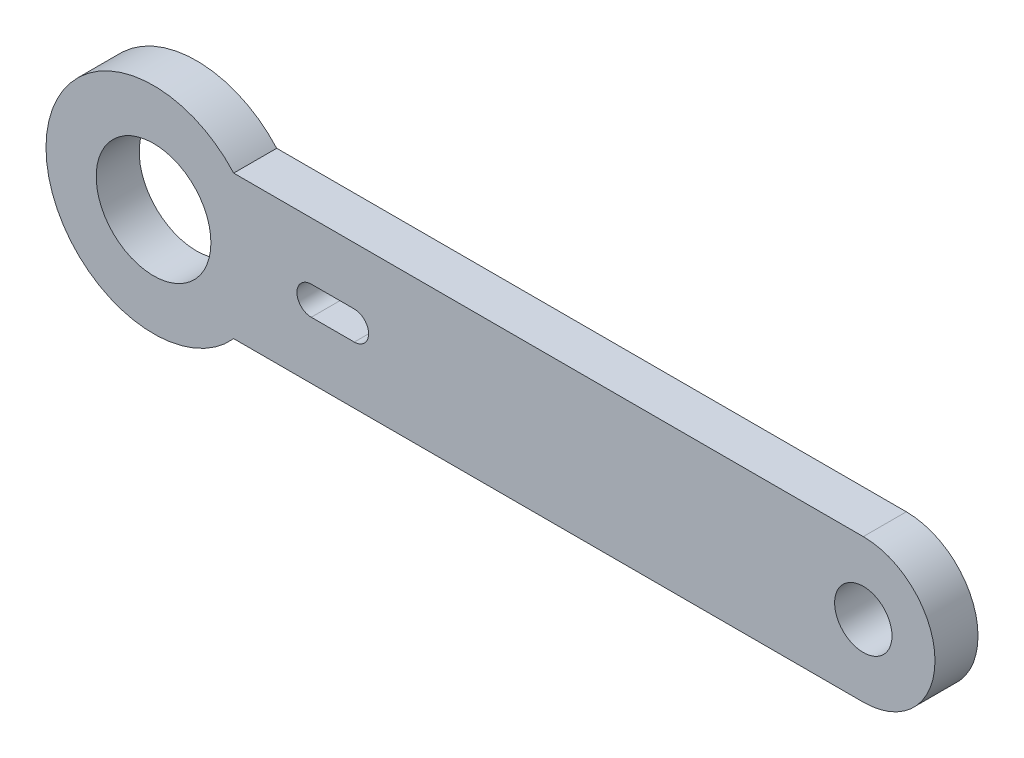
ISO-10303-21;
HEADER;
FILE_DESCRIPTION(('STEP AP214'),'2;1');
FILE_NAME('part.step','',(''),(''),'','','');
FILE_SCHEMA(('AUTOMOTIVE_DESIGN { 1 0 10303 214 1 1 1 1 }'));
ENDSEC;
DATA;
#1=APPLICATION_CONTEXT('core data for automotive mechanical design processes');
#2=APPLICATION_PROTOCOL_DEFINITION('international standard','automotive_design',2000,#1);
#3=PRODUCT_CONTEXT('',#1,'mechanical');
#4=PRODUCT('Part','Part','',(#3));
#5=PRODUCT_RELATED_PRODUCT_CATEGORY('part','',(#4));
#6=PRODUCT_DEFINITION_FORMATION('','',#4);
#7=PRODUCT_DEFINITION_CONTEXT('part definition',#1,'design');
#8=PRODUCT_DEFINITION('design','',#6,#7);
#9=PRODUCT_DEFINITION_SHAPE('','',#8);
#10=(LENGTH_UNIT() NAMED_UNIT(*) SI_UNIT(.MILLI.,.METRE.));
#11=(NAMED_UNIT(*) PLANE_ANGLE_UNIT() SI_UNIT($,.RADIAN.));
#12=(NAMED_UNIT(*) SI_UNIT($,.STERADIAN.) SOLID_ANGLE_UNIT());
#13=UNCERTAINTY_MEASURE_WITH_UNIT(LENGTH_MEASURE(1.E-05),#10,'distance_accuracy_value','');
#14=(GEOMETRIC_REPRESENTATION_CONTEXT(3) GLOBAL_UNCERTAINTY_ASSIGNED_CONTEXT((#13)) GLOBAL_UNIT_ASSIGNED_CONTEXT((#10,
#11,#12)) REPRESENTATION_CONTEXT('',''));
#15=CARTESIAN_POINT('',(0.,0.,0.));
#16=DIRECTION('',(0.,0.,1.));
#17=DIRECTION('',(1.,0.,0.));
#18=AXIS2_PLACEMENT_3D('',#15,#16,#17);
#19=CARTESIAN_POINT('',(49.5,0.,1.5));
#20=DIRECTION('',(0.,0.,1.));
#21=DIRECTION('',(1.,0.,0.));
#22=AXIS2_PLACEMENT_3D('',#19,#20,#21);
#23=PLANE('',#22);
#24=CARTESIAN_POINT('',(0.,0.,1.5));
#25=DIRECTION('',(0.,0.,1.));
#26=DIRECTION('',(1.,0.,0.));
#27=AXIS2_PLACEMENT_3D('',#24,#25,#26);
#28=CIRCLE('',#27,4.);
#29=CARTESIAN_POINT('',(4.,0.,1.5));
#30=VERTEX_POINT('',#29);
#31=EDGE_CURVE('E137',#30,#30,#28,.T.);
#32=ORIENTED_EDGE('',*,*,#31,.F.);
#33=EDGE_LOOP('',(#32));
#34=FACE_BOUND('',#33,.T.);
#35=CARTESIAN_POINT('',(49.5,0.,1.5));
#36=DIRECTION('',(0.,0.,1.));
#37=DIRECTION('',(1.,0.,0.));
#38=AXIS2_PLACEMENT_3D('',#35,#36,#37);
#39=CIRCLE('',#38,5.);
#40=CARTESIAN_POINT('',(49.5,-5.,1.5));
#41=VERTEX_POINT('',#40);
#42=CARTESIAN_POINT('',(49.5,5.,1.5));
#43=VERTEX_POINT('',#42);
#44=EDGE_CURVE('E143',#41,#43,#39,.T.);
#45=ORIENTED_EDGE('',*,*,#44,.T.);
#46=DIRECTION('',(-1.,0.,0.));
#47=VECTOR('',#46,1.);
#48=CARTESIAN_POINT('',(5.59016994374947,5.,1.5));
#49=LINE('',#48,#47);
#50=CARTESIAN_POINT('',(5.59016994374947,5.,1.5));
#51=VERTEX_POINT('',#50);
#52=EDGE_CURVE('E146',#43,#51,#49,.T.);
#53=ORIENTED_EDGE('',*,*,#52,.T.);
#54=CARTESIAN_POINT('',(0.,0.,1.5));
#55=DIRECTION('',(0.,0.,1.));
#56=DIRECTION('',(1.,0.,0.));
#57=AXIS2_PLACEMENT_3D('',#54,#55,#56);
#58=CIRCLE('',#57,7.5);
#59=CARTESIAN_POINT('',(5.59016994374947,-5.,1.5));
#60=VERTEX_POINT('',#59);
#61=EDGE_CURVE('E149',#51,#60,#58,.T.);
#62=ORIENTED_EDGE('',*,*,#61,.T.);
#63=DIRECTION('',(1.,0.,0.));
#64=VECTOR('',#63,1.);
#65=CARTESIAN_POINT('',(5.59016994374947,-5.,1.5));
#66=LINE('',#65,#64);
#67=EDGE_CURVE('E151',#60,#41,#66,.T.);
#68=ORIENTED_EDGE('',*,*,#67,.T.);
#69=EDGE_LOOP('',(#45,#53,#62,#68));
#70=FACE_BOUND('',#69,.T.);
#71=CARTESIAN_POINT('',(49.5,0.,1.5));
#72=DIRECTION('',(0.,0.,1.));
#73=DIRECTION('',(1.,0.,0.));
#74=AXIS2_PLACEMENT_3D('',#71,#72,#73);
#75=CIRCLE('',#74,2.);
#76=CARTESIAN_POINT('',(51.5,0.,1.5));
#77=VERTEX_POINT('',#76);
#78=EDGE_CURVE('E131',#77,#77,#75,.T.);
#79=ORIENTED_EDGE('',*,*,#78,.F.);
#80=EDGE_LOOP('',(#79));
#81=FACE_BOUND('',#80,.T.);
#82=DIRECTION('',(1.,0.,0.));
#83=VECTOR('',#82,1.);
#84=CARTESIAN_POINT('',(11.,-1.,1.5));
#85=LINE('',#84,#83);
#86=CARTESIAN_POINT('',(11.,-1.,1.5));
#87=VERTEX_POINT('',#86);
#88=CARTESIAN_POINT('',(14.,-0.999999999999999,1.5));
#89=VERTEX_POINT('',#88);
#90=EDGE_CURVE('E103',#87,#89,#85,.T.);
#91=ORIENTED_EDGE('',*,*,#90,.F.);
#92=CARTESIAN_POINT('',(11.,0.,1.5));
#93=DIRECTION('',(0.,0.,1.));
#94=DIRECTION('',(1.,0.,0.));
#95=AXIS2_PLACEMENT_3D('',#92,#93,#94);
#96=CIRCLE('',#95,1.);
#97=CARTESIAN_POINT('',(11.,1.,1.5));
#98=VERTEX_POINT('',#97);
#99=EDGE_CURVE('E95',#98,#87,#96,.T.);
#100=ORIENTED_EDGE('',*,*,#99,.F.);
#101=DIRECTION('',(-1.,0.,0.));
#102=VECTOR('',#101,1.);
#103=CARTESIAN_POINT('',(11.,1.,1.5));
#104=LINE('',#103,#102);
#105=CARTESIAN_POINT('',(14.,0.999999999999999,1.5));
#106=VERTEX_POINT('',#105);
#107=EDGE_CURVE('E117',#106,#98,#104,.T.);
#108=ORIENTED_EDGE('',*,*,#107,.F.);
#109=CARTESIAN_POINT('',(14.,0.,1.5));
#110=DIRECTION('',(0.,0.,1.));
#111=DIRECTION('',(1.,0.,0.));
#112=AXIS2_PLACEMENT_3D('',#109,#110,#111);
#113=CIRCLE('',#112,0.999999999999999);
#114=EDGE_CURVE('E115',#89,#106,#113,.T.);
#115=ORIENTED_EDGE('',*,*,#114,.F.);
#116=EDGE_LOOP('',(#91,#100,#108,#115));
#117=FACE_BOUND('',#116,.T.);
#118=ADVANCED_FACE('F30',(#34,#70,#81,#117),#23,.T.);
#119=CARTESIAN_POINT('',(49.5,0.,-1.5));
#120=DIRECTION('',(0.,0.,1.));
#121=DIRECTION('',(1.,0.,0.));
#122=AXIS2_PLACEMENT_3D('',#119,#120,#121);
#123=PLANE('',#122);
#124=CARTESIAN_POINT('',(49.5,0.,-1.5));
#125=DIRECTION('',(0.,0.,1.));
#126=DIRECTION('',(1.,0.,0.));
#127=AXIS2_PLACEMENT_3D('',#124,#125,#126);
#128=CIRCLE('',#127,2.);
#129=CARTESIAN_POINT('',(51.5,0.,-1.5));
#130=VERTEX_POINT('',#129);
#131=EDGE_CURVE('E111',#130,#130,#128,.T.);
#132=ORIENTED_EDGE('',*,*,#131,.T.);
#133=EDGE_LOOP('',(#132));
#134=FACE_BOUND('',#133,.T.);
#135=CARTESIAN_POINT('',(0.,0.,-1.5));
#136=DIRECTION('',(0.,0.,1.));
#137=DIRECTION('',(1.,0.,0.));
#138=AXIS2_PLACEMENT_3D('',#135,#136,#137);
#139=CIRCLE('',#138,4.);
#140=CARTESIAN_POINT('',(4.,0.,-1.5));
#141=VERTEX_POINT('',#140);
#142=EDGE_CURVE('E134',#141,#141,#139,.T.);
#143=ORIENTED_EDGE('',*,*,#142,.T.);
#144=EDGE_LOOP('',(#143));
#145=FACE_BOUND('',#144,.T.);
#146=CARTESIAN_POINT('',(49.5,0.,-1.5));
#147=DIRECTION('',(0.,0.,1.));
#148=DIRECTION('',(1.,0.,0.));
#149=AXIS2_PLACEMENT_3D('',#146,#147,#148);
#150=CIRCLE('',#149,5.);
#151=CARTESIAN_POINT('',(49.5,-5.,-1.5));
#152=VERTEX_POINT('',#151);
#153=CARTESIAN_POINT('',(49.5,5.,-1.5));
#154=VERTEX_POINT('',#153);
#155=EDGE_CURVE('E140',#152,#154,#150,.T.);
#156=ORIENTED_EDGE('',*,*,#155,.F.);
#157=DIRECTION('',(1.,0.,0.));
#158=VECTOR('',#157,1.);
#159=CARTESIAN_POINT('',(5.59016994374947,-5.,-1.5));
#160=LINE('',#159,#158);
#161=CARTESIAN_POINT('',(5.59016994374947,-5.,-1.5));
#162=VERTEX_POINT('',#161);
#163=EDGE_CURVE('E147',#162,#152,#160,.T.);
#164=ORIENTED_EDGE('',*,*,#163,.F.);
#165=CARTESIAN_POINT('',(0.,0.,-1.5));
#166=DIRECTION('',(0.,0.,1.));
#167=DIRECTION('',(1.,0.,0.));
#168=AXIS2_PLACEMENT_3D('',#165,#166,#167);
#169=CIRCLE('',#168,7.5);
#170=CARTESIAN_POINT('',(5.59016994374947,5.,-1.5));
#171=VERTEX_POINT('',#170);
#172=EDGE_CURVE('E158',#171,#162,#169,.T.);
#173=ORIENTED_EDGE('',*,*,#172,.F.);
#174=DIRECTION('',(-1.,0.,0.));
#175=VECTOR('',#174,1.);
#176=CARTESIAN_POINT('',(5.59016994374947,5.,-1.5));
#177=LINE('',#176,#175);
#178=EDGE_CURVE('E156',#154,#171,#177,.T.);
#179=ORIENTED_EDGE('',*,*,#178,.F.);
#180=EDGE_LOOP('',(#156,#164,#173,#179));
#181=FACE_BOUND('',#180,.T.);
#182=CARTESIAN_POINT('',(11.,0.,-1.5));
#183=DIRECTION('',(0.,0.,1.));
#184=DIRECTION('',(1.,0.,0.));
#185=AXIS2_PLACEMENT_3D('',#182,#183,#184);
#186=CIRCLE('',#185,1.);
#187=CARTESIAN_POINT('',(11.,1.,-1.5));
#188=VERTEX_POINT('',#187);
#189=CARTESIAN_POINT('',(11.,-1.,-1.5));
#190=VERTEX_POINT('',#189);
#191=EDGE_CURVE('E53',#188,#190,#186,.T.);
#192=ORIENTED_EDGE('',*,*,#191,.T.);
#193=DIRECTION('',(1.,0.,0.));
#194=VECTOR('',#193,1.);
#195=CARTESIAN_POINT('',(11.,-1.,-1.5));
#196=LINE('',#195,#194);
#197=CARTESIAN_POINT('',(14.,-0.999999999999999,-1.5));
#198=VERTEX_POINT('',#197);
#199=EDGE_CURVE('E110',#190,#198,#196,.T.);
#200=ORIENTED_EDGE('',*,*,#199,.T.);
#201=CARTESIAN_POINT('',(14.,0.,-1.5));
#202=DIRECTION('',(0.,0.,1.));
#203=DIRECTION('',(1.,0.,0.));
#204=AXIS2_PLACEMENT_3D('',#201,#202,#203);
#205=CIRCLE('',#204,0.999999999999999);
#206=CARTESIAN_POINT('',(14.,0.999999999999999,-1.5));
#207=VERTEX_POINT('',#206);
#208=EDGE_CURVE('E123',#198,#207,#205,.T.);
#209=ORIENTED_EDGE('',*,*,#208,.T.);
#210=DIRECTION('',(-1.,0.,0.));
#211=VECTOR('',#210,1.);
#212=CARTESIAN_POINT('',(11.,1.,-1.5));
#213=LINE('',#212,#211);
#214=EDGE_CURVE('E104',#207,#188,#213,.T.);
#215=ORIENTED_EDGE('',*,*,#214,.T.);
#216=EDGE_LOOP('',(#192,#200,#209,#215));
#217=FACE_BOUND('',#216,.T.);
#218=ADVANCED_FACE('F176',(#134,#145,#181,#217),#123,.F.);
#219=CARTESIAN_POINT('',(49.5,0.,1.5));
#220=DIRECTION('',(0.,0.,-1.));
#221=DIRECTION('',(-1.,0.,0.));
#222=AXIS2_PLACEMENT_3D('',#219,#220,#221);
#223=CYLINDRICAL_SURFACE('',#222,5.);
#224=ORIENTED_EDGE('',*,*,#155,.T.);
#225=DIRECTION('',(0.,0.,-1.));
#226=VECTOR('',#225,1.);
#227=CARTESIAN_POINT('',(49.5,5.,1.5));
#228=LINE('',#227,#226);
#229=EDGE_CURVE('E11',#43,#154,#228,.T.);
#230=ORIENTED_EDGE('',*,*,#229,.F.);
#231=ORIENTED_EDGE('',*,*,#44,.F.);
#232=DIRECTION('',(0.,0.,-1.));
#233=VECTOR('',#232,1.);
#234=CARTESIAN_POINT('',(49.5,-5.,1.5));
#235=LINE('',#234,#233);
#236=EDGE_CURVE('E153',#41,#152,#235,.T.);
#237=ORIENTED_EDGE('',*,*,#236,.T.);
#238=EDGE_LOOP('',(#224,#230,#231,#237));
#239=FACE_BOUND('',#238,.T.);
#240=ADVANCED_FACE('F32',(#239),#223,.T.);
#241=CARTESIAN_POINT('',(5.59016994374947,5.,1.5));
#242=DIRECTION('',(0.,-1.,0.));
#243=DIRECTION('',(0.,0.,-1.));
#244=AXIS2_PLACEMENT_3D('',#241,#242,#243);
#245=PLANE('',#244);
#246=ORIENTED_EDGE('',*,*,#178,.T.);
#247=DIRECTION('',(0.,0.,-1.));
#248=VECTOR('',#247,1.);
#249=CARTESIAN_POINT('',(5.59016994374947,5.,1.5));
#250=LINE('',#249,#248);
#251=EDGE_CURVE('E38',#51,#171,#250,.T.);
#252=ORIENTED_EDGE('',*,*,#251,.F.);
#253=ORIENTED_EDGE('',*,*,#52,.F.);
#254=ORIENTED_EDGE('',*,*,#229,.T.);
#255=EDGE_LOOP('',(#246,#252,#253,#254));
#256=FACE_BOUND('',#255,.T.);
#257=ADVANCED_FACE('F187',(#256),#245,.F.);
#258=CARTESIAN_POINT('',(0.,0.,1.5));
#259=DIRECTION('',(0.,0.,-1.));
#260=DIRECTION('',(-1.,0.,0.));
#261=AXIS2_PLACEMENT_3D('',#258,#259,#260);
#262=CYLINDRICAL_SURFACE('',#261,7.5);
#263=ORIENTED_EDGE('',*,*,#172,.T.);
#264=DIRECTION('',(0.,0.,-1.));
#265=VECTOR('',#264,1.);
#266=CARTESIAN_POINT('',(5.59016994374947,-5.,1.5));
#267=LINE('',#266,#265);
#268=EDGE_CURVE('E163',#60,#162,#267,.T.);
#269=ORIENTED_EDGE('',*,*,#268,.F.);
#270=ORIENTED_EDGE('',*,*,#61,.F.);
#271=ORIENTED_EDGE('',*,*,#251,.T.);
#272=EDGE_LOOP('',(#263,#269,#270,#271));
#273=FACE_BOUND('',#272,.T.);
#274=ADVANCED_FACE('F170',(#273),#262,.T.);
#275=CARTESIAN_POINT('',(5.59016994374947,-5.,1.5));
#276=DIRECTION('',(0.,1.,0.));
#277=DIRECTION('',(0.,0.,1.));
#278=AXIS2_PLACEMENT_3D('',#275,#276,#277);
#279=PLANE('',#278);
#280=ORIENTED_EDGE('',*,*,#163,.T.);
#281=ORIENTED_EDGE('',*,*,#236,.F.);
#282=ORIENTED_EDGE('',*,*,#67,.F.);
#283=ORIENTED_EDGE('',*,*,#268,.T.);
#284=EDGE_LOOP('',(#280,#281,#282,#283));
#285=FACE_BOUND('',#284,.T.);
#286=ADVANCED_FACE('F180',(#285),#279,.F.);
#287=CARTESIAN_POINT('',(0.,0.,1.5));
#288=DIRECTION('',(0.,0.,-1.));
#289=DIRECTION('',(-1.,0.,0.));
#290=AXIS2_PLACEMENT_3D('',#287,#288,#289);
#291=CYLINDRICAL_SURFACE('',#290,4.);
#292=ORIENTED_EDGE('',*,*,#31,.T.);
#293=EDGE_LOOP('',(#292));
#294=FACE_BOUND('',#293,.T.);
#295=ORIENTED_EDGE('',*,*,#142,.F.);
#296=EDGE_LOOP('',(#295));
#297=FACE_BOUND('',#296,.T.);
#298=ADVANCED_FACE('F204',(#294,#297),#291,.F.);
#299=CARTESIAN_POINT('',(49.5,0.,1.5));
#300=DIRECTION('',(0.,0.,-1.));
#301=DIRECTION('',(-1.,0.,0.));
#302=AXIS2_PLACEMENT_3D('',#299,#300,#301);
#303=CYLINDRICAL_SURFACE('',#302,2.);
#304=ORIENTED_EDGE('',*,*,#78,.T.);
#305=EDGE_LOOP('',(#304));
#306=FACE_BOUND('',#305,.T.);
#307=ORIENTED_EDGE('',*,*,#131,.F.);
#308=EDGE_LOOP('',(#307));
#309=FACE_BOUND('',#308,.T.);
#310=ADVANCED_FACE('F211',(#306,#309),#303,.F.);
#311=CARTESIAN_POINT('',(11.,0.,1.5));
#312=DIRECTION('',(0.,0.,-1.));
#313=DIRECTION('',(-1.,0.,0.));
#314=AXIS2_PLACEMENT_3D('',#311,#312,#313);
#315=CYLINDRICAL_SURFACE('',#314,1.);
#316=ORIENTED_EDGE('',*,*,#191,.F.);
#317=DIRECTION('',(0.,0.,-1.));
#318=VECTOR('',#317,1.);
#319=CARTESIAN_POINT('',(11.,1.,1.5));
#320=LINE('',#319,#318);
#321=EDGE_CURVE('E99',#98,#188,#320,.T.);
#322=ORIENTED_EDGE('',*,*,#321,.F.);
#323=ORIENTED_EDGE('',*,*,#99,.T.);
#324=DIRECTION('',(0.,0.,-1.));
#325=VECTOR('',#324,1.);
#326=CARTESIAN_POINT('',(11.,-1.,1.5));
#327=LINE('',#326,#325);
#328=EDGE_CURVE('E98',#87,#190,#327,.T.);
#329=ORIENTED_EDGE('',*,*,#328,.T.);
#330=EDGE_LOOP('',(#316,#322,#323,#329));
#331=FACE_BOUND('',#330,.T.);
#332=ADVANCED_FACE('F97',(#331),#315,.F.);
#333=CARTESIAN_POINT('',(11.,-1.,1.5));
#334=DIRECTION('',(0.,1.,0.));
#335=DIRECTION('',(-1.,0.,0.));
#336=AXIS2_PLACEMENT_3D('',#333,#334,#335);
#337=PLANE('',#336);
#338=ORIENTED_EDGE('',*,*,#199,.F.);
#339=ORIENTED_EDGE('',*,*,#328,.F.);
#340=ORIENTED_EDGE('',*,*,#90,.T.);
#341=DIRECTION('',(0.,0.,-1.));
#342=VECTOR('',#341,1.);
#343=CARTESIAN_POINT('',(14.,-0.999999999999999,1.5));
#344=LINE('',#343,#342);
#345=EDGE_CURVE('E112',#89,#198,#344,.T.);
#346=ORIENTED_EDGE('',*,*,#345,.T.);
#347=EDGE_LOOP('',(#338,#339,#340,#346));
#348=FACE_BOUND('',#347,.T.);
#349=ADVANCED_FACE('F107',(#348),#337,.T.);
#350=CARTESIAN_POINT('',(14.,0.,1.5));
#351=DIRECTION('',(0.,0.,-1.));
#352=DIRECTION('',(-1.,0.,0.));
#353=AXIS2_PLACEMENT_3D('',#350,#351,#352);
#354=CYLINDRICAL_SURFACE('',#353,0.999999999999999);
#355=ORIENTED_EDGE('',*,*,#208,.F.);
#356=ORIENTED_EDGE('',*,*,#345,.F.);
#357=ORIENTED_EDGE('',*,*,#114,.T.);
#358=DIRECTION('',(0.,0.,-1.));
#359=VECTOR('',#358,1.);
#360=CARTESIAN_POINT('',(14.,0.999999999999999,1.5));
#361=LINE('',#360,#359);
#362=EDGE_CURVE('E45',#106,#207,#361,.T.);
#363=ORIENTED_EDGE('',*,*,#362,.T.);
#364=EDGE_LOOP('',(#355,#356,#357,#363));
#365=FACE_BOUND('',#364,.T.);
#366=ADVANCED_FACE('F228',(#365),#354,.F.);
#367=CARTESIAN_POINT('',(11.,1.,1.5));
#368=DIRECTION('',(0.,-1.,0.));
#369=DIRECTION('',(1.,0.,0.));
#370=AXIS2_PLACEMENT_3D('',#367,#368,#369);
#371=PLANE('',#370);
#372=ORIENTED_EDGE('',*,*,#214,.F.);
#373=ORIENTED_EDGE('',*,*,#362,.F.);
#374=ORIENTED_EDGE('',*,*,#107,.T.);
#375=ORIENTED_EDGE('',*,*,#321,.T.);
#376=EDGE_LOOP('',(#372,#373,#374,#375));
#377=FACE_BOUND('',#376,.T.);
#378=ADVANCED_FACE('F231',(#377),#371,.T.);
#379=CLOSED_SHELL('',(#118,#218,#240,#257,#274,#286,#298,#310,#332,#349,#366,#378));
#380=MANIFOLD_SOLID_BREP('B2',#379);
#381=ADVANCED_BREP_SHAPE_REPRESENTATION('',(#18,#380),#14);
#382=SHAPE_DEFINITION_REPRESENTATION(#9,#381);
ENDSEC;
END-ISO-10303-21;
